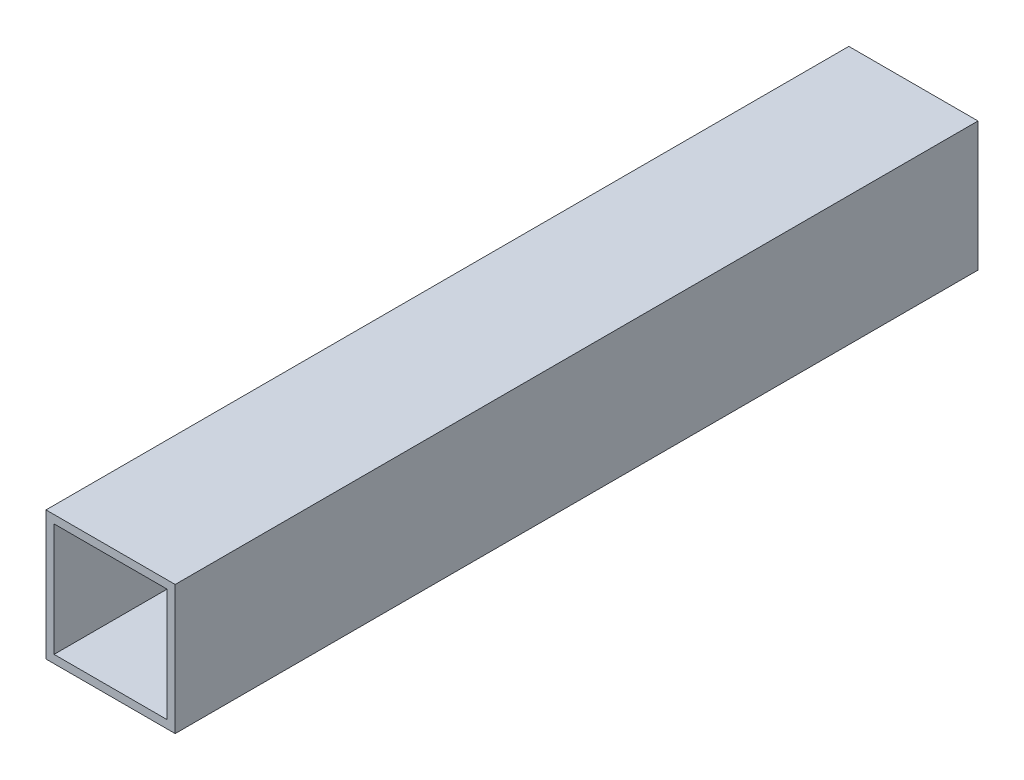
ISO-10303-21;
HEADER;
FILE_DESCRIPTION(('STEP AP214'),'2;1');
FILE_NAME('part.step','',(''),(''),'','','');
FILE_SCHEMA(('AUTOMOTIVE_DESIGN { 1 0 10303 214 1 1 1 1 }'));
ENDSEC;
DATA;
#1=APPLICATION_CONTEXT('core data for automotive mechanical design processes');
#2=APPLICATION_PROTOCOL_DEFINITION('international standard','automotive_design',2000,#1);
#3=PRODUCT_CONTEXT('',#1,'mechanical');
#4=PRODUCT('Part','Part','',(#3));
#5=PRODUCT_RELATED_PRODUCT_CATEGORY('part','',(#4));
#6=PRODUCT_DEFINITION_FORMATION('','',#4);
#7=PRODUCT_DEFINITION_CONTEXT('part definition',#1,'design');
#8=PRODUCT_DEFINITION('design','',#6,#7);
#9=PRODUCT_DEFINITION_SHAPE('','',#8);
#10=(LENGTH_UNIT() NAMED_UNIT(*) SI_UNIT(.MILLI.,.METRE.));
#11=(NAMED_UNIT(*) PLANE_ANGLE_UNIT() SI_UNIT($,.RADIAN.));
#12=(NAMED_UNIT(*) SI_UNIT($,.STERADIAN.) SOLID_ANGLE_UNIT());
#13=UNCERTAINTY_MEASURE_WITH_UNIT(LENGTH_MEASURE(1.E-05),#10,'distance_accuracy_value','');
#14=(GEOMETRIC_REPRESENTATION_CONTEXT(3) GLOBAL_UNCERTAINTY_ASSIGNED_CONTEXT((#13)) GLOBAL_UNIT_ASSIGNED_CONTEXT((#10,
#11,#12)) REPRESENTATION_CONTEXT('',''));
#15=CARTESIAN_POINT('',(0.,0.,0.));
#16=DIRECTION('',(0.,0.,1.));
#17=DIRECTION('',(1.,0.,0.));
#18=AXIS2_PLACEMENT_3D('',#15,#16,#17);
#19=CARTESIAN_POINT('',(0.,0.,315.722));
#20=DIRECTION('',(0.,0.,1.));
#21=DIRECTION('',(1.,0.,0.));
#22=AXIS2_PLACEMENT_3D('',#19,#20,#21);
#23=PLANE('',#22);
#24=DIRECTION('',(0.,-1.,0.));
#25=VECTOR('',#24,1.);
#26=CARTESIAN_POINT('',(-8.71436170212765,37.8297872340426,315.722));
#27=LINE('',#26,#25);
#28=CARTESIAN_POINT('',(-8.71436170212765,37.8297872340426,315.722));
#29=VERTEX_POINT('',#28);
#30=CARTESIAN_POINT('',(-8.71436170212765,-12.9702127659574,315.722));
#31=VERTEX_POINT('',#30);
#32=EDGE_CURVE('E139',#29,#31,#27,.T.);
#33=ORIENTED_EDGE('',*,*,#32,.T.);
#34=DIRECTION('',(1.,0.,0.));
#35=VECTOR('',#34,1.);
#36=CARTESIAN_POINT('',(-8.71436170212765,-12.9702127659574,315.722));
#37=LINE('',#36,#35);
#38=CARTESIAN_POINT('',(42.0856382978724,-12.9702127659574,315.722));
#39=VERTEX_POINT('',#38);
#40=EDGE_CURVE('E142',#31,#39,#37,.T.);
#41=ORIENTED_EDGE('',*,*,#40,.T.);
#42=DIRECTION('',(0.,1.,0.));
#43=VECTOR('',#42,1.);
#44=CARTESIAN_POINT('',(42.0856382978723,37.8297872340426,315.722));
#45=LINE('',#44,#43);
#46=CARTESIAN_POINT('',(42.0856382978723,37.8297872340426,315.722));
#47=VERTEX_POINT('',#46);
#48=EDGE_CURVE('E147',#39,#47,#45,.T.);
#49=ORIENTED_EDGE('',*,*,#48,.T.);
#50=DIRECTION('',(-1.,0.,0.));
#51=VECTOR('',#50,1.);
#52=CARTESIAN_POINT('',(-8.71436170212765,37.8297872340426,315.722));
#53=LINE('',#52,#51);
#54=EDGE_CURVE('E149',#47,#29,#53,.T.);
#55=ORIENTED_EDGE('',*,*,#54,.T.);
#56=EDGE_LOOP('',(#33,#41,#49,#55));
#57=FACE_BOUND('',#56,.T.);
#58=DIRECTION('',(1.,0.,0.));
#59=VECTOR('',#58,1.);
#60=CARTESIAN_POINT('',(-5.53936170212765,-9.79521276595742,315.722));
#61=LINE('',#60,#59);
#62=CARTESIAN_POINT('',(-5.53936170212765,-9.79521276595742,315.722));
#63=VERTEX_POINT('',#62);
#64=CARTESIAN_POINT('',(38.9106382978724,-9.79521276595742,315.722));
#65=VERTEX_POINT('',#64);
#66=EDGE_CURVE('E115',#63,#65,#61,.T.);
#67=ORIENTED_EDGE('',*,*,#66,.F.);
#68=DIRECTION('',(0.,-1.,0.));
#69=VECTOR('',#68,1.);
#70=CARTESIAN_POINT('',(-5.53936170212765,34.6547872340426,315.722));
#71=LINE('',#70,#69);
#72=CARTESIAN_POINT('',(-5.53936170212765,34.6547872340426,315.722));
#73=VERTEX_POINT('',#72);
#74=EDGE_CURVE('E101',#73,#63,#71,.T.);
#75=ORIENTED_EDGE('',*,*,#74,.F.);
#76=DIRECTION('',(-1.,0.,0.));
#77=VECTOR('',#76,1.);
#78=CARTESIAN_POINT('',(-5.53936170212765,34.6547872340426,315.722));
#79=LINE('',#78,#77);
#80=CARTESIAN_POINT('',(38.9106382978723,34.6547872340426,315.722));
#81=VERTEX_POINT('',#80);
#82=EDGE_CURVE('E128',#81,#73,#79,.T.);
#83=ORIENTED_EDGE('',*,*,#82,.F.);
#84=DIRECTION('',(0.,1.,0.));
#85=VECTOR('',#84,1.);
#86=CARTESIAN_POINT('',(38.9106382978723,34.6547872340426,315.722));
#87=LINE('',#86,#85);
#88=EDGE_CURVE('E125',#65,#81,#87,.T.);
#89=ORIENTED_EDGE('',*,*,#88,.F.);
#90=EDGE_LOOP('',(#67,#75,#83,#89));
#91=FACE_BOUND('',#90,.T.);
#92=ADVANCED_FACE('F39',(#57,#91),#23,.T.);
#93=CARTESIAN_POINT('',(0.,0.,0.));
#94=DIRECTION('',(0.,0.,1.));
#95=DIRECTION('',(1.,0.,0.));
#96=AXIS2_PLACEMENT_3D('',#93,#94,#95);
#97=PLANE('',#96);
#98=DIRECTION('',(0.,-1.,0.));
#99=VECTOR('',#98,1.);
#100=CARTESIAN_POINT('',(-8.71436170212765,37.8297872340426,0.));
#101=LINE('',#100,#99);
#102=CARTESIAN_POINT('',(-8.71436170212765,37.8297872340426,0.));
#103=VERTEX_POINT('',#102);
#104=CARTESIAN_POINT('',(-8.71436170212765,-12.9702127659574,0.));
#105=VERTEX_POINT('',#104);
#106=EDGE_CURVE('E119',#103,#105,#101,.T.);
#107=ORIENTED_EDGE('',*,*,#106,.F.);
#108=DIRECTION('',(-1.,0.,0.));
#109=VECTOR('',#108,1.);
#110=CARTESIAN_POINT('',(-8.71436170212765,37.8297872340426,0.));
#111=LINE('',#110,#109);
#112=CARTESIAN_POINT('',(42.0856382978723,37.8297872340426,0.));
#113=VERTEX_POINT('',#112);
#114=EDGE_CURVE('E143',#113,#103,#111,.T.);
#115=ORIENTED_EDGE('',*,*,#114,.F.);
#116=DIRECTION('',(0.,1.,0.));
#117=VECTOR('',#116,1.);
#118=CARTESIAN_POINT('',(42.0856382978723,37.8297872340426,0.));
#119=LINE('',#118,#117);
#120=CARTESIAN_POINT('',(42.0856382978724,-12.9702127659574,0.));
#121=VERTEX_POINT('',#120);
#122=EDGE_CURVE('E154',#121,#113,#119,.T.);
#123=ORIENTED_EDGE('',*,*,#122,.F.);
#124=DIRECTION('',(1.,0.,0.));
#125=VECTOR('',#124,1.);
#126=CARTESIAN_POINT('',(-8.71436170212765,-12.9702127659574,0.));
#127=LINE('',#126,#125);
#128=EDGE_CURVE('E151',#105,#121,#127,.T.);
#129=ORIENTED_EDGE('',*,*,#128,.F.);
#130=EDGE_LOOP('',(#107,#115,#123,#129));
#131=FACE_BOUND('',#130,.T.);
#132=DIRECTION('',(0.,-1.,0.));
#133=VECTOR('',#132,1.);
#134=CARTESIAN_POINT('',(-5.53936170212765,34.6547872340426,0.));
#135=LINE('',#134,#133);
#136=CARTESIAN_POINT('',(-5.53936170212765,34.6547872340426,0.));
#137=VERTEX_POINT('',#136);
#138=CARTESIAN_POINT('',(-5.53936170212765,-9.79521276595742,0.));
#139=VERTEX_POINT('',#138);
#140=EDGE_CURVE('E65',#137,#139,#135,.T.);
#141=ORIENTED_EDGE('',*,*,#140,.T.);
#142=DIRECTION('',(1.,0.,0.));
#143=VECTOR('',#142,1.);
#144=CARTESIAN_POINT('',(-5.53936170212765,-9.79521276595742,0.));
#145=LINE('',#144,#143);
#146=CARTESIAN_POINT('',(38.9106382978724,-9.79521276595742,0.));
#147=VERTEX_POINT('',#146);
#148=EDGE_CURVE('E117',#139,#147,#145,.T.);
#149=ORIENTED_EDGE('',*,*,#148,.T.);
#150=DIRECTION('',(0.,1.,0.));
#151=VECTOR('',#150,1.);
#152=CARTESIAN_POINT('',(38.9106382978723,34.6547872340426,0.));
#153=LINE('',#152,#151);
#154=CARTESIAN_POINT('',(38.9106382978723,34.6547872340426,0.));
#155=VERTEX_POINT('',#154);
#156=EDGE_CURVE('E135',#147,#155,#153,.T.);
#157=ORIENTED_EDGE('',*,*,#156,.T.);
#158=DIRECTION('',(-1.,0.,0.));
#159=VECTOR('',#158,1.);
#160=CARTESIAN_POINT('',(-5.53936170212765,34.6547872340426,0.));
#161=LINE('',#160,#159);
#162=EDGE_CURVE('E111',#155,#137,#161,.T.);
#163=ORIENTED_EDGE('',*,*,#162,.T.);
#164=EDGE_LOOP('',(#141,#149,#157,#163));
#165=FACE_BOUND('',#164,.T.);
#166=ADVANCED_FACE('F171',(#131,#165),#97,.F.);
#167=CARTESIAN_POINT('',(-8.71436170212765,37.8297872340426,315.722));
#168=DIRECTION('',(1.,0.,0.));
#169=DIRECTION('',(0.,1.,0.));
#170=AXIS2_PLACEMENT_3D('',#167,#168,#169);
#171=PLANE('',#170);
#172=ORIENTED_EDGE('',*,*,#106,.T.);
#173=DIRECTION('',(0.,0.,-1.));
#174=VECTOR('',#173,1.);
#175=CARTESIAN_POINT('',(-8.71436170212765,-12.9702127659574,315.722));
#176=LINE('',#175,#174);
#177=EDGE_CURVE('E11',#31,#105,#176,.T.);
#178=ORIENTED_EDGE('',*,*,#177,.F.);
#179=ORIENTED_EDGE('',*,*,#32,.F.);
#180=DIRECTION('',(0.,0.,-1.));
#181=VECTOR('',#180,1.);
#182=CARTESIAN_POINT('',(-8.71436170212765,37.8297872340426,315.722));
#183=LINE('',#182,#181);
#184=EDGE_CURVE('E148',#29,#103,#183,.T.);
#185=ORIENTED_EDGE('',*,*,#184,.T.);
#186=EDGE_LOOP('',(#172,#178,#179,#185));
#187=FACE_BOUND('',#186,.T.);
#188=ADVANCED_FACE('F41',(#187),#171,.F.);
#189=CARTESIAN_POINT('',(-8.71436170212765,-12.9702127659574,315.722));
#190=DIRECTION('',(0.,1.,0.));
#191=DIRECTION('',(0.,0.,1.));
#192=AXIS2_PLACEMENT_3D('',#189,#190,#191);
#193=PLANE('',#192);
#194=ORIENTED_EDGE('',*,*,#128,.T.);
#195=DIRECTION('',(0.,0.,-1.));
#196=VECTOR('',#195,1.);
#197=CARTESIAN_POINT('',(42.0856382978724,-12.9702127659574,315.722));
#198=LINE('',#197,#196);
#199=EDGE_CURVE('E50',#39,#121,#198,.T.);
#200=ORIENTED_EDGE('',*,*,#199,.F.);
#201=ORIENTED_EDGE('',*,*,#40,.F.);
#202=ORIENTED_EDGE('',*,*,#177,.T.);
#203=EDGE_LOOP('',(#194,#200,#201,#202));
#204=FACE_BOUND('',#203,.T.);
#205=ADVANCED_FACE('F183',(#204),#193,.F.);
#206=CARTESIAN_POINT('',(42.0856382978723,37.8297872340426,315.722));
#207=DIRECTION('',(-1.,0.,0.));
#208=DIRECTION('',(0.,-1.,0.));
#209=AXIS2_PLACEMENT_3D('',#206,#207,#208);
#210=PLANE('',#209);
#211=ORIENTED_EDGE('',*,*,#122,.T.);
#212=DIRECTION('',(0.,0.,-1.));
#213=VECTOR('',#212,1.);
#214=CARTESIAN_POINT('',(42.0856382978723,37.8297872340426,315.722));
#215=LINE('',#214,#213);
#216=EDGE_CURVE('E158',#47,#113,#215,.T.);
#217=ORIENTED_EDGE('',*,*,#216,.F.);
#218=ORIENTED_EDGE('',*,*,#48,.F.);
#219=ORIENTED_EDGE('',*,*,#199,.T.);
#220=EDGE_LOOP('',(#211,#217,#218,#219));
#221=FACE_BOUND('',#220,.T.);
#222=ADVANCED_FACE('F167',(#221),#210,.F.);
#223=CARTESIAN_POINT('',(-8.71436170212765,37.8297872340426,315.722));
#224=DIRECTION('',(0.,-1.,0.));
#225=DIRECTION('',(0.,0.,-1.));
#226=AXIS2_PLACEMENT_3D('',#223,#224,#225);
#227=PLANE('',#226);
#228=ORIENTED_EDGE('',*,*,#114,.T.);
#229=ORIENTED_EDGE('',*,*,#184,.F.);
#230=ORIENTED_EDGE('',*,*,#54,.F.);
#231=ORIENTED_EDGE('',*,*,#216,.T.);
#232=EDGE_LOOP('',(#228,#229,#230,#231));
#233=FACE_BOUND('',#232,.T.);
#234=ADVANCED_FACE('F180',(#233),#227,.F.);
#235=CARTESIAN_POINT('',(-5.53936170212765,34.6547872340426,315.722));
#236=DIRECTION('',(1.,0.,0.));
#237=DIRECTION('',(0.,1.,0.));
#238=AXIS2_PLACEMENT_3D('',#235,#236,#237);
#239=PLANE('',#238);
#240=ORIENTED_EDGE('',*,*,#140,.F.);
#241=DIRECTION('',(0.,0.,-1.));
#242=VECTOR('',#241,1.);
#243=CARTESIAN_POINT('',(-5.53936170212765,34.6547872340426,315.722));
#244=LINE('',#243,#242);
#245=EDGE_CURVE('E106',#73,#137,#244,.T.);
#246=ORIENTED_EDGE('',*,*,#245,.F.);
#247=ORIENTED_EDGE('',*,*,#74,.T.);
#248=DIRECTION('',(0.,0.,-1.));
#249=VECTOR('',#248,1.);
#250=CARTESIAN_POINT('',(-5.53936170212765,-9.79521276595742,315.722));
#251=LINE('',#250,#249);
#252=EDGE_CURVE('E110',#63,#139,#251,.T.);
#253=ORIENTED_EDGE('',*,*,#252,.T.);
#254=EDGE_LOOP('',(#240,#246,#247,#253));
#255=FACE_BOUND('',#254,.T.);
#256=ADVANCED_FACE('F108',(#255),#239,.T.);
#257=CARTESIAN_POINT('',(-5.53936170212765,-9.79521276595742,315.722));
#258=DIRECTION('',(0.,1.,0.));
#259=DIRECTION('',(0.,0.,1.));
#260=AXIS2_PLACEMENT_3D('',#257,#258,#259);
#261=PLANE('',#260);
#262=ORIENTED_EDGE('',*,*,#148,.F.);
#263=ORIENTED_EDGE('',*,*,#252,.F.);
#264=ORIENTED_EDGE('',*,*,#66,.T.);
#265=DIRECTION('',(0.,0.,-1.));
#266=VECTOR('',#265,1.);
#267=CARTESIAN_POINT('',(38.9106382978724,-9.79521276595742,315.722));
#268=LINE('',#267,#266);
#269=EDGE_CURVE('E123',#65,#147,#268,.T.);
#270=ORIENTED_EDGE('',*,*,#269,.T.);
#271=EDGE_LOOP('',(#262,#263,#264,#270));
#272=FACE_BOUND('',#271,.T.);
#273=ADVANCED_FACE('F118',(#272),#261,.T.);
#274=CARTESIAN_POINT('',(38.9106382978723,34.6547872340426,315.722));
#275=DIRECTION('',(-1.,0.,0.));
#276=DIRECTION('',(0.,-1.,0.));
#277=AXIS2_PLACEMENT_3D('',#274,#275,#276);
#278=PLANE('',#277);
#279=ORIENTED_EDGE('',*,*,#156,.F.);
#280=ORIENTED_EDGE('',*,*,#269,.F.);
#281=ORIENTED_EDGE('',*,*,#88,.T.);
#282=DIRECTION('',(0.,0.,-1.));
#283=VECTOR('',#282,1.);
#284=CARTESIAN_POINT('',(38.9106382978723,34.6547872340426,315.722));
#285=LINE('',#284,#283);
#286=EDGE_CURVE('E53',#81,#155,#285,.T.);
#287=ORIENTED_EDGE('',*,*,#286,.T.);
#288=EDGE_LOOP('',(#279,#280,#281,#287));
#289=FACE_BOUND('',#288,.T.);
#290=ADVANCED_FACE('F208',(#289),#278,.T.);
#291=CARTESIAN_POINT('',(-5.53936170212765,34.6547872340426,315.722));
#292=DIRECTION('',(0.,-1.,0.));
#293=DIRECTION('',(0.,0.,-1.));
#294=AXIS2_PLACEMENT_3D('',#291,#292,#293);
#295=PLANE('',#294);
#296=ORIENTED_EDGE('',*,*,#162,.F.);
#297=ORIENTED_EDGE('',*,*,#286,.F.);
#298=ORIENTED_EDGE('',*,*,#82,.T.);
#299=ORIENTED_EDGE('',*,*,#245,.T.);
#300=EDGE_LOOP('',(#296,#297,#298,#299));
#301=FACE_BOUND('',#300,.T.);
#302=ADVANCED_FACE('F209',(#301),#295,.T.);
#303=CLOSED_SHELL('',(#92,#166,#188,#205,#222,#234,#256,#273,#290,#302));
#304=MANIFOLD_SOLID_BREP('B2',#303);
#305=ADVANCED_BREP_SHAPE_REPRESENTATION('',(#18,#304),#14);
#306=SHAPE_DEFINITION_REPRESENTATION(#9,#305);
ENDSEC;
END-ISO-10303-21;
